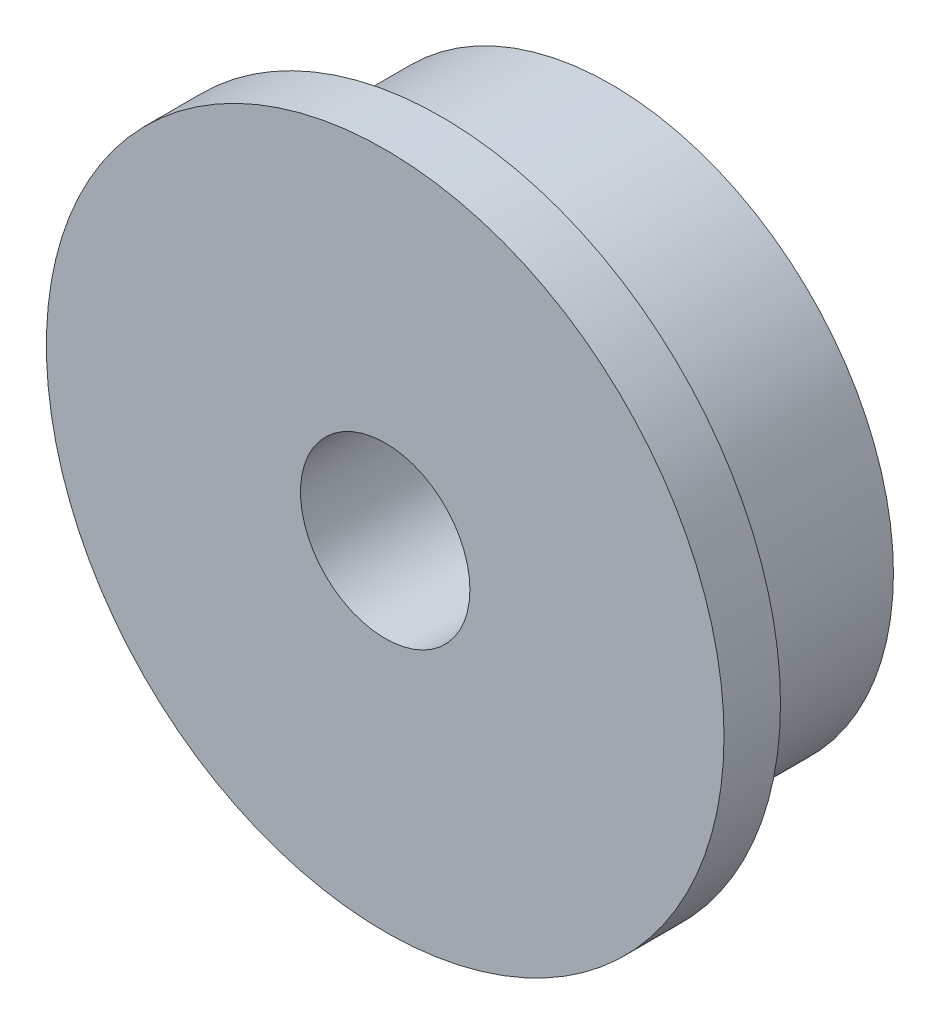
ISO-10303-21;
HEADER;
FILE_DESCRIPTION(('STEP AP214'),'2;1');
FILE_NAME('part.step','',(''),(''),'','','');
FILE_SCHEMA(('AUTOMOTIVE_DESIGN { 1 0 10303 214 1 1 1 1 }'));
ENDSEC;
DATA;
#1=APPLICATION_CONTEXT('core data for automotive mechanical design processes');
#2=APPLICATION_PROTOCOL_DEFINITION('international standard','automotive_design',2000,#1);
#3=PRODUCT_CONTEXT('',#1,'mechanical');
#4=PRODUCT('Part','Part','',(#3));
#5=PRODUCT_RELATED_PRODUCT_CATEGORY('part','',(#4));
#6=PRODUCT_DEFINITION_FORMATION('','',#4);
#7=PRODUCT_DEFINITION_CONTEXT('part definition',#1,'design');
#8=PRODUCT_DEFINITION('design','',#6,#7);
#9=PRODUCT_DEFINITION_SHAPE('','',#8);
#10=(LENGTH_UNIT() NAMED_UNIT(*) SI_UNIT(.MILLI.,.METRE.));
#11=(NAMED_UNIT(*) PLANE_ANGLE_UNIT() SI_UNIT($,.RADIAN.));
#12=(NAMED_UNIT(*) SI_UNIT($,.STERADIAN.) SOLID_ANGLE_UNIT());
#13=UNCERTAINTY_MEASURE_WITH_UNIT(LENGTH_MEASURE(1.E-05),#10,'distance_accuracy_value','');
#14=(GEOMETRIC_REPRESENTATION_CONTEXT(3) GLOBAL_UNCERTAINTY_ASSIGNED_CONTEXT((#13)) GLOBAL_UNIT_ASSIGNED_CONTEXT((#10,
#11,#12)) REPRESENTATION_CONTEXT('',''));
#15=CARTESIAN_POINT('',(0.,0.,0.));
#16=DIRECTION('',(0.,0.,1.));
#17=DIRECTION('',(1.,0.,0.));
#18=AXIS2_PLACEMENT_3D('',#15,#16,#17);
#19=CARTESIAN_POINT('',(0.,0.,4.));
#20=DIRECTION('',(0.,0.,-1.));
#21=DIRECTION('',(-1.,0.,0.));
#22=AXIS2_PLACEMENT_3D('',#19,#20,#21);
#23=CYLINDRICAL_SURFACE('',#22,5.);
#24=CARTESIAN_POINT('',(0.,0.,0.));
#25=DIRECTION('',(0.,0.,1.));
#26=DIRECTION('',(1.,0.,0.));
#27=AXIS2_PLACEMENT_3D('',#24,#25,#26);
#28=CIRCLE('',#27,5.);
#29=CARTESIAN_POINT('',(5.,0.,0.));
#30=VERTEX_POINT('',#29);
#31=EDGE_CURVE('E37',#30,#30,#28,.T.);
#32=ORIENTED_EDGE('',*,*,#31,.T.);
#33=EDGE_LOOP('',(#32));
#34=FACE_BOUND('',#33,.T.);
#35=CARTESIAN_POINT('',(0.,0.,3.));
#36=DIRECTION('',(0.,0.,1.));
#37=DIRECTION('',(1.,0.,0.));
#38=AXIS2_PLACEMENT_3D('',#35,#36,#37);
#39=CIRCLE('',#38,5.);
#40=CARTESIAN_POINT('',(5.,0.,3.));
#41=VERTEX_POINT('',#40);
#42=EDGE_CURVE('E10',#41,#41,#39,.T.);
#43=ORIENTED_EDGE('',*,*,#42,.F.);
#44=EDGE_LOOP('',(#43));
#45=FACE_BOUND('',#44,.T.);
#46=ADVANCED_FACE('F31',(#34,#45),#23,.T.);
#47=CARTESIAN_POINT('',(0.,0.,4.));
#48=DIRECTION('',(0.,0.,1.));
#49=DIRECTION('',(1.,0.,0.));
#50=AXIS2_PLACEMENT_3D('',#47,#48,#49);
#51=PLANE('',#50);
#52=CARTESIAN_POINT('',(0.,0.,4.));
#53=DIRECTION('',(0.,0.,1.));
#54=DIRECTION('',(1.,0.,0.));
#55=AXIS2_PLACEMENT_3D('',#52,#53,#54);
#56=CIRCLE('',#55,1.5);
#57=CARTESIAN_POINT('',(1.5,0.,4.));
#58=VERTEX_POINT('',#57);
#59=EDGE_CURVE('E41',#58,#58,#56,.T.);
#60=ORIENTED_EDGE('',*,*,#59,.F.);
#61=EDGE_LOOP('',(#60));
#62=FACE_BOUND('',#61,.T.);
#63=CARTESIAN_POINT('',(0.,0.,4.));
#64=DIRECTION('',(0.,0.,1.));
#65=DIRECTION('',(1.,0.,0.));
#66=AXIS2_PLACEMENT_3D('',#63,#64,#65);
#67=CIRCLE('',#66,6.);
#68=CARTESIAN_POINT('',(6.,0.,4.));
#69=VERTEX_POINT('',#68);
#70=EDGE_CURVE('E51',#69,#69,#67,.T.);
#71=ORIENTED_EDGE('',*,*,#70,.T.);
#72=EDGE_LOOP('',(#71));
#73=FACE_BOUND('',#72,.T.);
#74=ADVANCED_FACE('F69',(#62,#73),#51,.T.);
#75=CARTESIAN_POINT('',(0.,0.,0.));
#76=DIRECTION('',(0.,0.,1.));
#77=DIRECTION('',(1.,0.,0.));
#78=AXIS2_PLACEMENT_3D('',#75,#76,#77);
#79=PLANE('',#78);
#80=ORIENTED_EDGE('',*,*,#31,.F.);
#81=EDGE_LOOP('',(#80));
#82=FACE_BOUND('',#81,.T.);
#83=CARTESIAN_POINT('',(0.,0.,0.));
#84=DIRECTION('',(0.,0.,1.));
#85=DIRECTION('',(1.,0.,0.));
#86=AXIS2_PLACEMENT_3D('',#83,#84,#85);
#87=CIRCLE('',#86,1.5);
#88=CARTESIAN_POINT('',(1.5,0.,0.));
#89=VERTEX_POINT('',#88);
#90=EDGE_CURVE('E45',#89,#89,#87,.T.);
#91=ORIENTED_EDGE('',*,*,#90,.T.);
#92=EDGE_LOOP('',(#91));
#93=FACE_BOUND('',#92,.T.);
#94=ADVANCED_FACE('F73',(#82,#93),#79,.F.);
#95=CARTESIAN_POINT('',(0.,0.,4.));
#96=DIRECTION('',(0.,0.,-1.));
#97=DIRECTION('',(-1.,0.,0.));
#98=AXIS2_PLACEMENT_3D('',#95,#96,#97);
#99=CYLINDRICAL_SURFACE('',#98,1.5);
#100=ORIENTED_EDGE('',*,*,#59,.T.);
#101=EDGE_LOOP('',(#100));
#102=FACE_BOUND('',#101,.T.);
#103=ORIENTED_EDGE('',*,*,#90,.F.);
#104=EDGE_LOOP('',(#103));
#105=FACE_BOUND('',#104,.T.);
#106=ADVANCED_FACE('F66',(#102,#105),#99,.F.);
#107=CARTESIAN_POINT('',(0.,0.,3.));
#108=DIRECTION('',(0.,0.,1.));
#109=DIRECTION('',(1.,0.,0.));
#110=AXIS2_PLACEMENT_3D('',#107,#108,#109);
#111=CYLINDRICAL_SURFACE('',#110,6.);
#112=CARTESIAN_POINT('',(0.,0.,3.));
#113=DIRECTION('',(0.,0.,1.));
#114=DIRECTION('',(1.,0.,0.));
#115=AXIS2_PLACEMENT_3D('',#112,#113,#114);
#116=CIRCLE('',#115,6.);
#117=CARTESIAN_POINT('',(6.,0.,3.));
#118=VERTEX_POINT('',#117);
#119=EDGE_CURVE('E49',#118,#118,#116,.T.);
#120=ORIENTED_EDGE('',*,*,#119,.T.);
#121=EDGE_LOOP('',(#120));
#122=FACE_BOUND('',#121,.T.);
#123=ORIENTED_EDGE('',*,*,#70,.F.);
#124=EDGE_LOOP('',(#123));
#125=FACE_BOUND('',#124,.T.);
#126=ADVANCED_FACE('F57',(#122,#125),#111,.T.);
#127=CARTESIAN_POINT('',(0.,0.,3.));
#128=DIRECTION('',(0.,0.,1.));
#129=DIRECTION('',(1.,0.,0.));
#130=AXIS2_PLACEMENT_3D('',#127,#128,#129);
#131=PLANE('',#130);
#132=ORIENTED_EDGE('',*,*,#42,.T.);
#133=EDGE_LOOP('',(#132));
#134=FACE_BOUND('',#133,.T.);
#135=ORIENTED_EDGE('',*,*,#119,.F.);
#136=EDGE_LOOP('',(#135));
#137=FACE_BOUND('',#136,.T.);
#138=ADVANCED_FACE('F60',(#134,#137),#131,.F.);
#139=CLOSED_SHELL('',(#46,#74,#94,#106,#126,#138));
#140=MANIFOLD_SOLID_BREP('B2',#139);
#141=ADVANCED_BREP_SHAPE_REPRESENTATION('',(#18,#140),#14);
#142=SHAPE_DEFINITION_REPRESENTATION(#9,#141);
ENDSEC;
END-ISO-10303-21;
